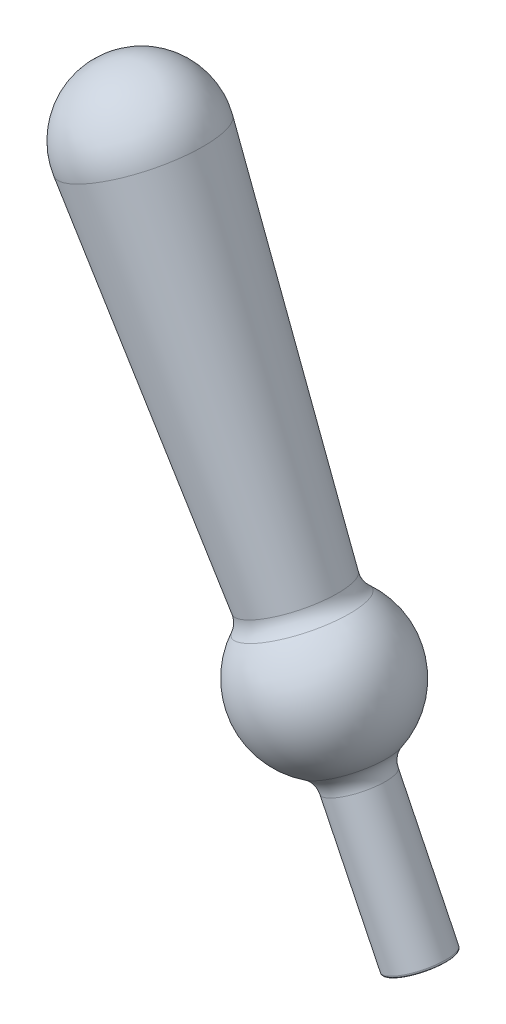
ISO-10303-21;
HEADER;
FILE_DESCRIPTION(('STEP AP214'),'2;1');
FILE_NAME('part.step','',(''),(''),'','','');
FILE_SCHEMA(('AUTOMOTIVE_DESIGN { 1 0 10303 214 1 1 1 1 }'));
ENDSEC;
DATA;
#1=APPLICATION_CONTEXT('core data for automotive mechanical design processes');
#2=APPLICATION_PROTOCOL_DEFINITION('international standard','automotive_design',2000,#1);
#3=PRODUCT_CONTEXT('',#1,'mechanical');
#4=PRODUCT('Part','Part','',(#3));
#5=PRODUCT_RELATED_PRODUCT_CATEGORY('part','',(#4));
#6=PRODUCT_DEFINITION_FORMATION('','',#4);
#7=PRODUCT_DEFINITION_CONTEXT('part definition',#1,'design');
#8=PRODUCT_DEFINITION('design','',#6,#7);
#9=PRODUCT_DEFINITION_SHAPE('','',#8);
#10=(LENGTH_UNIT() NAMED_UNIT(*) SI_UNIT(.MILLI.,.METRE.));
#11=(NAMED_UNIT(*) PLANE_ANGLE_UNIT() SI_UNIT($,.RADIAN.));
#12=(NAMED_UNIT(*) SI_UNIT($,.STERADIAN.) SOLID_ANGLE_UNIT());
#13=UNCERTAINTY_MEASURE_WITH_UNIT(LENGTH_MEASURE(1.E-05),#10,'distance_accuracy_value','');
#14=(GEOMETRIC_REPRESENTATION_CONTEXT(3) GLOBAL_UNCERTAINTY_ASSIGNED_CONTEXT((#13)) GLOBAL_UNIT_ASSIGNED_CONTEXT((#10,
#11,#12)) REPRESENTATION_CONTEXT('',''));
#15=CARTESIAN_POINT('',(0.,0.,0.));
#16=DIRECTION('',(0.,0.,1.));
#17=DIRECTION('',(1.,0.,0.));
#18=AXIS2_PLACEMENT_3D('',#15,#16,#17);
#19=CARTESIAN_POINT('',(3.79398239961608,14.6681284817486,0.));
#20=DIRECTION('',(0.438371146789079,-0.898794046299166,0.));
#21=DIRECTION('',(0.898794046299166,0.438371146789079,0.));
#22=AXIS2_PLACEMENT_3D('',#19,#20,#21);
#23=PLANE('',#22);
#24=CARTESIAN_POINT('',(4.60289704128533,15.0626625138587,0.));
#25=DIRECTION('',(-0.438371146789079,0.898794046299166,0.));
#26=DIRECTION('',(-0.898794046299166,-0.438371146789079,0.));
#27=AXIS2_PLACEMENT_3D('',#24,#25,#26);
#28=CIRCLE('',#27,0.900000000000001);
#29=CARTESIAN_POINT('',(3.79398239961608,14.6681284817486,0.));
#30=VERTEX_POINT('',#29);
#31=EDGE_CURVE('E10',#30,#30,#28,.T.);
#32=ORIENTED_EDGE('',*,*,#31,.T.);
#33=EDGE_LOOP('',(#32));
#34=FACE_BOUND('',#33,.T.);
#35=CARTESIAN_POINT('',(4.60289704128533,15.0626625138587,0.));
#36=DIRECTION('',(-0.438371146789079,0.898794046299166,0.));
#37=DIRECTION('',(-0.898794046299166,-0.438371146789079,0.));
#38=AXIS2_PLACEMENT_3D('',#35,#36,#37);
#39=CIRCLE('',#38,1.3);
#40=CARTESIAN_POINT('',(3.43446478109641,14.4927800230329,0.));
#41=VERTEX_POINT('',#40);
#42=EDGE_CURVE('E41',#41,#41,#39,.T.);
#43=ORIENTED_EDGE('',*,*,#42,.F.);
#44=EDGE_LOOP('',(#43));
#45=FACE_BOUND('',#44,.T.);
#46=ADVANCED_FACE('F34',(#34,#45),#23,.T.);
#47=CARTESIAN_POINT('',(-8.72358582110267,42.3860015213534,0.));
#48=DIRECTION('',(-0.438371146789079,0.898794046299166,0.));
#49=DIRECTION('',(0.898794046299166,0.438371146789079,0.));
#50=AXIS2_PLACEMENT_3D('',#47,#48,#49);
#51=SPHERICAL_SURFACE('',#50,3.2);
#52=CARTESIAN_POINT('',(-8.64405787774642,42.2229450735772,0.));
#53=DIRECTION('',(-0.438371146789079,0.898794046299166,0.));
#54=DIRECTION('',(-0.898794046299166,-0.438371146789079,0.));
#55=AXIS2_PLACEMENT_3D('',#52,#53,#54);
#56=CIRCLE('',#55,3.19485334578352);
#57=CARTESIAN_POINT('',(-11.5155730437356,40.8224135485631,0.));
#58=VERTEX_POINT('',#57);
#59=EDGE_CURVE('E63',#58,#58,#56,.T.);
#60=ORIENTED_EDGE('',*,*,#59,.T.);
#61=EDGE_LOOP('',(#60));
#62=FACE_BOUND('',#61,.T.);
#63=ADVANCED_FACE('F85',(#62),#51,.T.);
#64=CARTESIAN_POINT('',(-8.64405787774642,42.2229450735772,0.));
#65=DIRECTION('',(-0.438371146789079,0.898794046299166,0.));
#66=DIRECTION('',(-0.898794046299166,-0.438371146789079,0.));
#67=AXIS2_PLACEMENT_3D('',#64,#65,#66);
#68=CONICAL_SURFACE('',#67,3.19485334578352,0.0567232006898164);
#69=CARTESIAN_POINT('',(-1.38775725896514,27.3453240392358,0.));
#70=DIRECTION('',(-0.438371146789079,0.898794046299166,0.));
#71=DIRECTION('',(-0.898794046299166,-0.438371146789079,0.));
#72=AXIS2_PLACEMENT_3D('',#69,#70,#71);
#73=CIRCLE('',#72,2.25491326816774);
#74=CARTESIAN_POINT('',(-3.41445987931531,26.3568351239592,0.));
#75=VERTEX_POINT('',#74);
#76=EDGE_CURVE('E60',#75,#75,#73,.T.);
#77=ORIENTED_EDGE('',*,*,#76,.T.);
#78=EDGE_LOOP('',(#77));
#79=FACE_BOUND('',#78,.T.);
#80=ORIENTED_EDGE('',*,*,#59,.F.);
#81=EDGE_LOOP('',(#80));
#82=FACE_BOUND('',#81,.T.);
#83=ADVANCED_FACE('F87',(#79,#82),#68,.T.);
#84=CARTESIAN_POINT('',(-1.36290477666632,27.2943688993057,0.));
#85=DIRECTION('',(-0.438371146789079,0.898794046299166,0.));
#86=DIRECTION('',(-0.898794046299166,-0.438371146789079,0.));
#87=AXIS2_PLACEMENT_3D('',#84,#85,#86);
#88=TOROIDAL_SURFACE('',#87,3.25330493872509,1.);
#89=CARTESIAN_POINT('',(-1.06003704851824,26.6733980327933,0.));
#90=DIRECTION('',(-0.438371146789079,0.898794046299166,0.));
#91=DIRECTION('',(-0.898794046299166,-0.438371146789079,0.));
#92=AXIS2_PLACEMENT_3D('',#89,#90,#91);
#93=CIRCLE('',#92,2.53034828567507);
#94=CARTESIAN_POINT('',(-3.33429902274631,25.5641663530262,0.));
#95=VERTEX_POINT('',#94);
#96=EDGE_CURVE('E57',#95,#95,#93,.T.);
#97=ORIENTED_EDGE('',*,*,#96,.T.);
#98=EDGE_LOOP('',(#97));
#99=FACE_BOUND('',#98,.T.);
#100=ORIENTED_EDGE('',*,*,#76,.F.);
#101=EDGE_LOOP('',(#100));
#102=FACE_BOUND('',#101,.T.);
#103=ADVANCED_FACE('F94',(#99,#102),#88,.F.);
#104=CARTESIAN_POINT('',(0.,24.5,0.));
#105=DIRECTION('',(-0.438371146789079,0.898794046299166,0.));
#106=DIRECTION('',(-0.898794046299166,-0.438371146789079,0.));
#107=AXIS2_PLACEMENT_3D('',#104,#105,#106);
#108=SPHERICAL_SURFACE('',#107,3.5);
#109=CARTESIAN_POINT('',(1.29787146709011,21.838969145149,0.));
#110=DIRECTION('',(-0.438371146789079,0.898794046299166,0.));
#111=DIRECTION('',(-0.898794046299166,-0.438371146789079,0.));
#112=AXIS2_PLACEMENT_3D('',#109,#110,#111);
#113=CIRCLE('',#112,1.86666666666667);
#114=CARTESIAN_POINT('',(-0.379877419334997,21.0206763378094,0.));
#115=VERTEX_POINT('',#114);
#116=EDGE_CURVE('E54',#115,#115,#113,.T.);
#117=CARTESIAN_POINT('',(-0.379877419334997,21.0206763378094,0.));
#118=CARTESIAN_POINT('',(-0.444063435653636,21.0276822828904,0.));
#119=CARTESIAN_POINT('',(-0.508054926859455,21.0364681622274,0.));
#120=CARTESIAN_POINT('',(-0.63545432043941,21.0575643746765,0.));
#121=CARTESIAN_POINT('',(-0.698862222813547,21.0698747077885,0.));
#122=CARTESIAN_POINT('',(-0.824899900124097,21.0979844130507,0.));
#123=CARTESIAN_POINT('',(-0.887529675060511,21.1137837852008,0.));
#124=CARTESIAN_POINT('',(-1.01181942041533,21.1488225782722,0.));
#125=CARTESIAN_POINT('',(-1.07347939083373,21.1680619991936,0.));
#126=CARTESIAN_POINT('',(-1.19564069140387,21.2099221406332,0.));
#127=CARTESIAN_POINT('',(-1.25614202155561,21.2325428611515,0.));
#128=CARTESIAN_POINT('',(-1.37580078808755,21.2810962911337,0.));
#129=CARTESIAN_POINT('',(-1.43495822446776,21.3070290005976,0.));
#130=CARTESIAN_POINT('',(-1.55174805586943,21.362127011829,0.));
#131=CARTESIAN_POINT('',(-1.60938045089089,21.3912923135966,0.));
#132=CARTESIAN_POINT('',(-1.72294372427635,21.4527661993849,0.));
#133=CARTESIAN_POINT('',(-1.77887460264035,21.4850747834057,0.));
#134=CARTESIAN_POINT('',(-1.88886357695502,21.5527363026182,0.));
#135=CARTESIAN_POINT('',(-1.94292167290569,21.5880892378099,0.));
#136=CARTESIAN_POINT('',(-2.04899955145114,21.6617312051215,0.));
#137=CARTESIAN_POINT('',(-2.10101933404593,21.7000202372414,0.));
#138=CARTESIAN_POINT('',(-2.20286129639699,21.7794171538483,0.));
#139=CARTESIAN_POINT('',(-2.25268347615327,21.8205250383353,0.));
#140=CARTESIAN_POINT('',(-2.34997767262426,21.9054337834472,0.));
#141=CARTESIAN_POINT('',(-2.39744968933896,21.949234644072,0.));
#142=CARTESIAN_POINT('',(-2.48989819594086,22.0393952191041,0.));
#143=CARTESIAN_POINT('',(-2.53487468582805,22.0857549335114,0.));
#144=CARTESIAN_POINT('',(-2.62219441652799,22.1808912582967,0.));
#145=CARTESIAN_POINT('',(-2.66453765734074,22.2296678686745,0.));
#146=CARTESIAN_POINT('',(-2.74646123090129,22.3294886268273,0.));
#147=CARTESIAN_POINT('',(-2.78604156364908,22.3805327746022,0.));
#148=CARTESIAN_POINT('',(-2.86231812237388,22.4847323055619,0.));
#149=CARTESIAN_POINT('',(-2.89901434835089,22.5378876887468,0.));
#150=CARTESIAN_POINT('',(-2.9694103262348,22.646146923738,0.));
#151=CARTESIAN_POINT('',(-3.0031100781417,22.7012507755444,0.));
#152=CARTESIAN_POINT('',(-3.06740991607184,22.8132382145958,0.));
#153=CARTESIAN_POINT('',(-3.09801000209509,22.8701218018408,0.));
#154=CARTESIAN_POINT('',(-3.15601680791307,22.985494528869,0.));
#155=CARTESIAN_POINT('',(-3.18342352770782,23.0439836686521,0.));
#156=CARTESIAN_POINT('',(-3.23495967911243,23.1623884015033,0.));
#157=CARTESIAN_POINT('',(-3.2590891107223,23.2223039945712,0.));
#158=CARTESIAN_POINT('',(-3.30399679916438,23.343378166804,0.));
#159=CARTESIAN_POINT('',(-3.32477505599657,23.4045367459687,0.));
#160=CARTESIAN_POINT('',(-3.36291676990863,23.5279096170679,0.));
#161=CARTESIAN_POINT('',(-3.38028022698848,23.5901239090023,0.));
#162=CARTESIAN_POINT('',(-3.41153917283937,23.7154176996166,0.));
#163=CARTESIAN_POINT('',(-3.42543466161039,23.7784971982964,0.));
#164=CARTESIAN_POINT('',(-3.44971512160804,23.9053282470523,0.));
#165=CARTESIAN_POINT('',(-3.46010009283466,23.9690797971284,0.));
#166=CARTESIAN_POINT('',(-3.47732771776182,24.0970597353699,0.));
#167=CARTESIAN_POINT('',(-3.48417037146236,24.1612881235354,0.));
#168=CARTESIAN_POINT('',(-3.49429240931559,24.2900250647979,0.));
#169=CARTESIAN_POINT('',(-3.49757179346829,24.354533617895,0.));
#170=CARTESIAN_POINT('',(-3.50055724735192,24.483633356956,0.));
#171=CARTESIAN_POINT('',(-3.50026331708285,24.5482245429198,0.));
#172=CARTESIAN_POINT('',(-3.49610305370036,24.6772917664104,0.));
#173=CARTESIAN_POINT('',(-3.49223672058693,24.7417678039371,0.));
#174=CARTESIAN_POINT('',(-3.48094344754164,24.870407287698,0.));
#175=CARTESIAN_POINT('',(-3.47351650760976,24.9345707339321,0.));
#176=CARTESIAN_POINT('',(-3.45512492358232,25.0623886022339,0.));
#177=CARTESIAN_POINT('',(-3.44416027948675,25.1260430243017,0.));
#178=CARTESIAN_POINT('',(-3.41872626229334,25.2526477730324,0.));
#179=CARTESIAN_POINT('',(-3.40425688919549,25.3155980996954,0.));
#180=CARTESIAN_POINT('',(-3.37185995836007,25.4406024777654,0.));
#181=CARTESIAN_POINT('',(-3.35393240062249,25.5026565291725,0.));
#182=CARTESIAN_POINT('',(-3.33429902274631,25.5641663530262,0.));
#183=B_SPLINE_CURVE_WITH_KNOTS('',3,(#117,#118,#119,#120,#121,#122,#123,#124,#125,#126,#127,
#128,#129,#130,#131,#132,#133,#134,#135,#136,#137,#138,#139,#140,#141,#142,#143,#144,#145,#146,
#147,#148,#149,#150,#151,#152,#153,#154,#155,#156,#157,#158,#159,#160,#161,#162,#163,#164,#165,
#166,#167,#168,#169,#170,#171,#172,#173,#174,#175,#176,#177,#178,#179,#180,#181,#182),
.UNSPECIFIED.,.F.,.F.,(4,2,2,2,2,2,2,2,2,2,2,2,2,2,2,2,2,2,2,2,2,2,2,2,2,2,2,2,2,2,2,2,4),(0.,
0.193676672528671,0.387353345057341,0.581030017586011,0.774706690114681,0.968383362643352,
1.16206003517202,1.35573670770069,1.54941338022936,1.74309005275803,1.9367667252867,
2.13044339781537,2.32412007034404,2.51779674287271,2.71147341540138,2.90515008793005,
3.09882676045872,3.2925034329874,3.48618010551606,3.67985677804474,3.87353345057341,
4.06721012310208,4.26088679563075,4.45456346815942,4.64824014068808,4.84191681321676,
5.03559348574543,5.2292701582741,5.42294683080277,5.61662350333144,5.81030017586011,
6.00397684838878,6.19765352091745),.UNSPECIFIED.);
#184=EDGE_CURVE('BSEAM101',#115,#95,#183,.T.);
#185=ORIENTED_EDGE('',*,*,#116,.T.);
#186=ORIENTED_EDGE('',*,*,#96,.F.);
#187=ORIENTED_EDGE('',*,*,#184,.T.);
#188=ORIENTED_EDGE('',*,*,#184,.F.);
#189=EDGE_LOOP('',(#185,#187,#186,#188));
#190=FACE_BOUND('',#189,.T.);
#191=ADVANCED_FACE('F101',(#190),#108,.T.);
#192=CARTESIAN_POINT('',(1.66869188625871,21.0786746151916,0.));
#193=DIRECTION('',(-0.438371146789079,0.898794046299166,0.));
#194=DIRECTION('',(-0.898794046299166,-0.438371146789079,0.));
#195=AXIS2_PLACEMENT_3D('',#192,#193,#194);
#196=TOROIDAL_SURFACE('',#195,2.4,1.);
#197=CARTESIAN_POINT('',(1.66869188625871,21.0786746151916,0.));
#198=DIRECTION('',(-0.438371146789079,0.898794046299166,0.));
#199=DIRECTION('',(-0.898794046299166,-0.438371146789079,0.));
#200=AXIS2_PLACEMENT_3D('',#197,#198,#199);
#201=CIRCLE('',#200,1.4);
#202=CARTESIAN_POINT('',(0.410380221439871,20.4649550096869,0.));
#203=VERTEX_POINT('',#202);
#204=EDGE_CURVE('E49',#203,#203,#201,.T.);
#205=ORIENTED_EDGE('',*,*,#204,.T.);
#206=EDGE_LOOP('',(#205));
#207=FACE_BOUND('',#206,.T.);
#208=ORIENTED_EDGE('',*,*,#116,.F.);
#209=EDGE_LOOP('',(#208));
#210=FACE_BOUND('',#209,.T.);
#211=ADVANCED_FACE('F105',(#207,#210),#196,.F.);
#212=CARTESIAN_POINT('',(-12.2348391849123,49.5851377819304,0.));
#213=DIRECTION('',(-0.438371146789079,0.898794046299166,0.));
#214=DIRECTION('',(-0.898794046299166,-0.438371146789079,0.));
#215=AXIS2_PLACEMENT_3D('',#212,#213,#214);
#216=CYLINDRICAL_SURFACE('',#215,1.4);
#217=CARTESIAN_POINT('',(4.55905992660642,15.1525419184887,0.));
#218=DIRECTION('',(-0.438371146789079,0.898794046299166,0.));
#219=DIRECTION('',(-0.898794046299166,-0.438371146789079,0.));
#220=AXIS2_PLACEMENT_3D('',#217,#218,#219);
#221=CIRCLE('',#220,1.4);
#222=CARTESIAN_POINT('',(3.30074826178759,14.5388223129839,0.));
#223=VERTEX_POINT('',#222);
#224=EDGE_CURVE('E45',#223,#223,#221,.T.);
#225=ORIENTED_EDGE('',*,*,#224,.T.);
#226=EDGE_LOOP('',(#225));
#227=FACE_BOUND('',#226,.T.);
#228=ORIENTED_EDGE('',*,*,#204,.F.);
#229=EDGE_LOOP('',(#228));
#230=FACE_BOUND('',#229,.T.);
#231=ADVANCED_FACE('F109',(#227,#230),#216,.T.);
#232=CARTESIAN_POINT('',(4.55905992660642,15.1525419184887,0.));
#233=DIRECTION('',(-0.438371146789079,0.898794046299166,0.));
#234=DIRECTION('',(-0.898794046299166,-0.438371146789079,0.));
#235=AXIS2_PLACEMENT_3D('',#232,#233,#234);
#236=TOROIDAL_SURFACE('',#235,1.3,0.0999999999999997);
#237=ORIENTED_EDGE('',*,*,#42,.T.);
#238=EDGE_LOOP('',(#237));
#239=FACE_BOUND('',#238,.T.);
#240=ORIENTED_EDGE('',*,*,#224,.F.);
#241=EDGE_LOOP('',(#240));
#242=FACE_BOUND('',#241,.T.);
#243=ADVANCED_FACE('F97',(#239,#242),#236,.T.);
#244=CARTESIAN_POINT('',(4.55905992660642,15.1525419184887,0.));
#245=DIRECTION('',(-0.438371146789079,0.898794046299166,0.));
#246=DIRECTION('',(-0.898794046299166,-0.438371146789079,0.));
#247=AXIS2_PLACEMENT_3D('',#244,#245,#246);
#248=TOROIDAL_SURFACE('',#247,0.899999999999997,0.1);
#249=CARTESIAN_POINT('',(4.55905992660642,15.1525419184887,0.));
#250=DIRECTION('',(-0.438371146789079,0.898794046299166,0.));
#251=DIRECTION('',(-0.898794046299166,-0.438371146789079,0.));
#252=AXIS2_PLACEMENT_3D('',#249,#250,#251);
#253=CIRCLE('',#252,0.799999999999997);
#254=CARTESIAN_POINT('',(3.84002468956709,14.8018450010574,0.));
#255=VERTEX_POINT('',#254);
#256=EDGE_CURVE('E69',#255,#255,#253,.T.);
#257=ORIENTED_EDGE('',*,*,#256,.T.);
#258=EDGE_LOOP('',(#257));
#259=FACE_BOUND('',#258,.T.);
#260=ORIENTED_EDGE('',*,*,#31,.F.);
#261=EDGE_LOOP('',(#260));
#262=FACE_BOUND('',#261,.T.);
#263=ADVANCED_FACE('F36',(#259,#262),#248,.T.);
#264=CARTESIAN_POINT('',(1.0959278669727,22.2530148842521,0.));
#265=DIRECTION('',(0.438371146789079,-0.898794046299166,0.));
#266=DIRECTION('',(0.898794046299166,0.438371146789079,0.));
#267=AXIS2_PLACEMENT_3D('',#264,#265,#266);
#268=PLANE('',#267);
#269=CARTESIAN_POINT('',(1.0959278669727,22.2530148842521,0.));
#270=DIRECTION('',(-0.438371146789079,0.898794046299166,0.));
#271=DIRECTION('',(-0.898794046299166,-0.438371146789079,0.));
#272=AXIS2_PLACEMENT_3D('',#269,#270,#271);
#273=CIRCLE('',#272,0.799999999999997);
#274=CARTESIAN_POINT('',(0.376892629933366,21.9023179668208,0.));
#275=VERTEX_POINT('',#274);
#276=EDGE_CURVE('E66',#275,#275,#273,.T.);
#277=ORIENTED_EDGE('',*,*,#276,.F.);
#278=EDGE_LOOP('',(#277));
#279=FACE_BOUND('',#278,.T.);
#280=ADVANCED_FACE('F77',(#279),#268,.T.);
#281=CARTESIAN_POINT('',(-12.2348391849123,49.5851377819304,0.));
#282=DIRECTION('',(-0.438371146789079,0.898794046299166,0.));
#283=DIRECTION('',(-0.898794046299166,-0.438371146789079,0.));
#284=AXIS2_PLACEMENT_3D('',#281,#282,#283);
#285=CYLINDRICAL_SURFACE('',#284,0.799999999999998);
#286=ORIENTED_EDGE('',*,*,#276,.T.);
#287=EDGE_LOOP('',(#286));
#288=FACE_BOUND('',#287,.T.);
#289=ORIENTED_EDGE('',*,*,#256,.F.);
#290=EDGE_LOOP('',(#289));
#291=FACE_BOUND('',#290,.T.);
#292=ADVANCED_FACE('F75',(#288,#291),#285,.F.);
#293=CLOSED_SHELL('',(#46,#63,#83,#103,#191,#211,#231,#243,#263,#280,#292));
#294=MANIFOLD_SOLID_BREP('B2',#293);
#295=ADVANCED_BREP_SHAPE_REPRESENTATION('',(#18,#294),#14);
#296=SHAPE_DEFINITION_REPRESENTATION(#9,#295);
ENDSEC;
END-ISO-10303-21;
